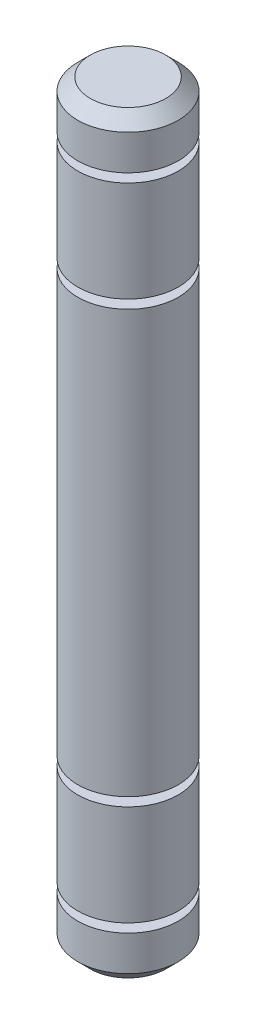
ISO-10303-21;
HEADER;
FILE_DESCRIPTION(('STEP AP214'),'2;1');
FILE_NAME('part.step','',(''),(''),'','','');
FILE_SCHEMA(('AUTOMOTIVE_DESIGN { 1 0 10303 214 1 1 1 1 }'));
ENDSEC;
DATA;
#1=APPLICATION_CONTEXT('core data for automotive mechanical design processes');
#2=APPLICATION_PROTOCOL_DEFINITION('international standard','automotive_design',2000,#1);
#3=PRODUCT_CONTEXT('',#1,'mechanical');
#4=PRODUCT('Part','Part','',(#3));
#5=PRODUCT_RELATED_PRODUCT_CATEGORY('part','',(#4));
#6=PRODUCT_DEFINITION_FORMATION('','',#4);
#7=PRODUCT_DEFINITION_CONTEXT('part definition',#1,'design');
#8=PRODUCT_DEFINITION('design','',#6,#7);
#9=PRODUCT_DEFINITION_SHAPE('','',#8);
#10=(LENGTH_UNIT() NAMED_UNIT(*) SI_UNIT(.MILLI.,.METRE.));
#11=(NAMED_UNIT(*) PLANE_ANGLE_UNIT() SI_UNIT($,.RADIAN.));
#12=(NAMED_UNIT(*) SI_UNIT($,.STERADIAN.) SOLID_ANGLE_UNIT());
#13=UNCERTAINTY_MEASURE_WITH_UNIT(LENGTH_MEASURE(1.E-05),#10,'distance_accuracy_value','');
#14=(GEOMETRIC_REPRESENTATION_CONTEXT(3) GLOBAL_UNCERTAINTY_ASSIGNED_CONTEXT((#13)) GLOBAL_UNIT_ASSIGNED_CONTEXT((#10,
#11,#12)) REPRESENTATION_CONTEXT('',''));
#15=CARTESIAN_POINT('',(0.,0.,0.));
#16=DIRECTION('',(0.,0.,1.));
#17=DIRECTION('',(1.,0.,0.));
#18=AXIS2_PLACEMENT_3D('',#15,#16,#17);
#19=CARTESIAN_POINT('',(4.,0.,0.));
#20=DIRECTION('',(0.,-1.,0.));
#21=DIRECTION('',(1.,0.,0.));
#22=AXIS2_PLACEMENT_3D('',#19,#20,#21);
#23=PLANE('',#22);
#24=CARTESIAN_POINT('',(0.,0.,0.));
#25=DIRECTION('',(0.,-1.,0.));
#26=DIRECTION('',(1.,0.,0.));
#27=AXIS2_PLACEMENT_3D('',#24,#25,#26);
#28=CIRCLE('',#27,2.99999999999998);
#29=CARTESIAN_POINT('',(2.99999999999998,0.,0.));
#30=VERTEX_POINT('',#29);
#31=EDGE_CURVE('E63',#30,#30,#28,.T.);
#32=ORIENTED_EDGE('',*,*,#31,.T.);
#33=EDGE_LOOP('',(#32));
#34=FACE_BOUND('',#33,.T.);
#35=ADVANCED_FACE('F44',(#34),#23,.T.);
#36=CARTESIAN_POINT('',(0.,0.,0.));
#37=DIRECTION('',(0.,-1.,0.));
#38=DIRECTION('',(1.,0.,0.));
#39=AXIS2_PLACEMENT_3D('',#36,#37,#38);
#40=CYLINDRICAL_SURFACE('',#39,4.);
#41=CARTESIAN_POINT('',(0.,1.00000000000002,0.));
#42=DIRECTION('',(0.,-1.,0.));
#43=DIRECTION('',(1.,0.,0.));
#44=AXIS2_PLACEMENT_3D('',#41,#42,#43);
#45=CIRCLE('',#44,4.);
#46=CARTESIAN_POINT('',(4.,1.00000000000002,0.));
#47=VERTEX_POINT('',#46);
#48=EDGE_CURVE('E58',#47,#47,#45,.F.);
#49=ORIENTED_EDGE('',*,*,#48,.T.);
#50=EDGE_LOOP('',(#49));
#51=FACE_BOUND('',#50,.T.);
#52=CARTESIAN_POINT('',(0.,3.8,0.));
#53=DIRECTION('',(0.,-1.,0.));
#54=DIRECTION('',(1.,0.,0.));
#55=AXIS2_PLACEMENT_3D('',#52,#53,#54);
#56=CIRCLE('',#55,4.);
#57=CARTESIAN_POINT('',(4.,3.8,0.));
#58=VERTEX_POINT('',#57);
#59=EDGE_CURVE('E69',#58,#58,#56,.T.);
#60=ORIENTED_EDGE('',*,*,#59,.T.);
#61=EDGE_LOOP('',(#60));
#62=FACE_BOUND('',#61,.T.);
#63=ADVANCED_FACE('F183',(#51,#62),#40,.T.);
#64=CARTESIAN_POINT('',(2.9,3.8,0.));
#65=DIRECTION('',(0.,1.,0.));
#66=DIRECTION('',(-1.,0.,0.));
#67=AXIS2_PLACEMENT_3D('',#64,#65,#66);
#68=PLANE('',#67);
#69=CARTESIAN_POINT('',(0.,3.8,0.));
#70=DIRECTION('',(0.,-1.,0.));
#71=DIRECTION('',(1.,0.,0.));
#72=AXIS2_PLACEMENT_3D('',#69,#70,#71);
#73=CIRCLE('',#72,2.9);
#74=CARTESIAN_POINT('',(2.9,3.8,0.));
#75=VERTEX_POINT('',#74);
#76=EDGE_CURVE('E73',#75,#75,#73,.T.);
#77=ORIENTED_EDGE('',*,*,#76,.T.);
#78=EDGE_LOOP('',(#77));
#79=FACE_BOUND('',#78,.T.);
#80=ORIENTED_EDGE('',*,*,#59,.F.);
#81=EDGE_LOOP('',(#80));
#82=FACE_BOUND('',#81,.T.);
#83=ADVANCED_FACE('F188',(#79,#82),#68,.T.);
#84=CARTESIAN_POINT('',(0.,4.,0.));
#85=DIRECTION('',(0.,-1.,0.));
#86=DIRECTION('',(1.,0.,0.));
#87=AXIS2_PLACEMENT_3D('',#84,#85,#86);
#88=TOROIDAL_SURFACE('',#87,2.9,0.2);
#89=CARTESIAN_POINT('',(0.,4.,0.));
#90=DIRECTION('',(0.,-1.,0.));
#91=DIRECTION('',(1.,0.,0.));
#92=AXIS2_PLACEMENT_3D('',#89,#90,#91);
#93=CIRCLE('',#92,2.7);
#94=CARTESIAN_POINT('',(2.7,4.,0.));
#95=VERTEX_POINT('',#94);
#96=EDGE_CURVE('E77',#95,#95,#93,.T.);
#97=ORIENTED_EDGE('',*,*,#96,.T.);
#98=EDGE_LOOP('',(#97));
#99=FACE_BOUND('',#98,.T.);
#100=ORIENTED_EDGE('',*,*,#76,.F.);
#101=EDGE_LOOP('',(#100));
#102=FACE_BOUND('',#101,.T.);
#103=ADVANCED_FACE('F208',(#99,#102),#88,.F.);
#104=CARTESIAN_POINT('',(0.,0.,0.));
#105=DIRECTION('',(0.,-1.,0.));
#106=DIRECTION('',(1.,0.,0.));
#107=AXIS2_PLACEMENT_3D('',#104,#105,#106);
#108=CYLINDRICAL_SURFACE('',#107,2.7);
#109=CARTESIAN_POINT('',(0.,4.3,0.));
#110=DIRECTION('',(0.,-1.,0.));
#111=DIRECTION('',(1.,0.,0.));
#112=AXIS2_PLACEMENT_3D('',#109,#110,#111);
#113=CIRCLE('',#112,2.7);
#114=CARTESIAN_POINT('',(2.7,4.3,0.));
#115=VERTEX_POINT('',#114);
#116=EDGE_CURVE('E81',#115,#115,#113,.T.);
#117=ORIENTED_EDGE('',*,*,#116,.T.);
#118=EDGE_LOOP('',(#117));
#119=FACE_BOUND('',#118,.T.);
#120=ORIENTED_EDGE('',*,*,#96,.F.);
#121=EDGE_LOOP('',(#120));
#122=FACE_BOUND('',#121,.T.);
#123=ADVANCED_FACE('F213',(#119,#122),#108,.T.);
#124=CARTESIAN_POINT('',(0.,4.3,0.));
#125=DIRECTION('',(0.,-1.,0.));
#126=DIRECTION('',(1.,0.,0.));
#127=AXIS2_PLACEMENT_3D('',#124,#125,#126);
#128=TOROIDAL_SURFACE('',#127,2.9,0.2);
#129=CARTESIAN_POINT('',(0.,4.5,0.));
#130=DIRECTION('',(0.,-1.,0.));
#131=DIRECTION('',(1.,0.,0.));
#132=AXIS2_PLACEMENT_3D('',#129,#130,#131);
#133=CIRCLE('',#132,2.9);
#134=CARTESIAN_POINT('',(2.9,4.5,0.));
#135=VERTEX_POINT('',#134);
#136=EDGE_CURVE('E85',#135,#135,#133,.T.);
#137=ORIENTED_EDGE('',*,*,#136,.T.);
#138=EDGE_LOOP('',(#137));
#139=FACE_BOUND('',#138,.T.);
#140=ORIENTED_EDGE('',*,*,#116,.F.);
#141=EDGE_LOOP('',(#140));
#142=FACE_BOUND('',#141,.T.);
#143=ADVANCED_FACE('F219',(#139,#142),#128,.F.);
#144=CARTESIAN_POINT('',(4.,4.5,0.));
#145=DIRECTION('',(0.,-1.,0.));
#146=DIRECTION('',(1.,0.,0.));
#147=AXIS2_PLACEMENT_3D('',#144,#145,#146);
#148=PLANE('',#147);
#149=CARTESIAN_POINT('',(0.,4.5,0.));
#150=DIRECTION('',(0.,-1.,0.));
#151=DIRECTION('',(1.,0.,0.));
#152=AXIS2_PLACEMENT_3D('',#149,#150,#151);
#153=CIRCLE('',#152,4.);
#154=CARTESIAN_POINT('',(4.,4.5,0.));
#155=VERTEX_POINT('',#154);
#156=EDGE_CURVE('E89',#155,#155,#153,.T.);
#157=ORIENTED_EDGE('',*,*,#156,.T.);
#158=EDGE_LOOP('',(#157));
#159=FACE_BOUND('',#158,.T.);
#160=ORIENTED_EDGE('',*,*,#136,.F.);
#161=EDGE_LOOP('',(#160));
#162=FACE_BOUND('',#161,.T.);
#163=ADVANCED_FACE('F223',(#159,#162),#148,.T.);
#164=CARTESIAN_POINT('',(0.,0.,0.));
#165=DIRECTION('',(0.,-1.,0.));
#166=DIRECTION('',(1.,0.,0.));
#167=AXIS2_PLACEMENT_3D('',#164,#165,#166);
#168=CYLINDRICAL_SURFACE('',#167,4.);
#169=CARTESIAN_POINT('',(0.,12.5,0.));
#170=DIRECTION('',(0.,-1.,0.));
#171=DIRECTION('',(1.,0.,0.));
#172=AXIS2_PLACEMENT_3D('',#169,#170,#171);
#173=CIRCLE('',#172,4.);
#174=CARTESIAN_POINT('',(4.,12.5,0.));
#175=VERTEX_POINT('',#174);
#176=EDGE_CURVE('E93',#175,#175,#173,.T.);
#177=ORIENTED_EDGE('',*,*,#176,.T.);
#178=EDGE_LOOP('',(#177));
#179=FACE_BOUND('',#178,.T.);
#180=ORIENTED_EDGE('',*,*,#156,.F.);
#181=EDGE_LOOP('',(#180));
#182=FACE_BOUND('',#181,.T.);
#183=ADVANCED_FACE('F227',(#179,#182),#168,.T.);
#184=CARTESIAN_POINT('',(2.9,12.5,0.));
#185=DIRECTION('',(0.,1.,0.));
#186=DIRECTION('',(-1.,0.,0.));
#187=AXIS2_PLACEMENT_3D('',#184,#185,#186);
#188=PLANE('',#187);
#189=CARTESIAN_POINT('',(0.,12.5,0.));
#190=DIRECTION('',(0.,-1.,0.));
#191=DIRECTION('',(1.,0.,0.));
#192=AXIS2_PLACEMENT_3D('',#189,#190,#191);
#193=CIRCLE('',#192,2.9);
#194=CARTESIAN_POINT('',(2.9,12.5,0.));
#195=VERTEX_POINT('',#194);
#196=EDGE_CURVE('E97',#195,#195,#193,.T.);
#197=ORIENTED_EDGE('',*,*,#196,.T.);
#198=EDGE_LOOP('',(#197));
#199=FACE_BOUND('',#198,.T.);
#200=ORIENTED_EDGE('',*,*,#176,.F.);
#201=EDGE_LOOP('',(#200));
#202=FACE_BOUND('',#201,.T.);
#203=ADVANCED_FACE('F231',(#199,#202),#188,.T.);
#204=CARTESIAN_POINT('',(0.,12.7,0.));
#205=DIRECTION('',(0.,-1.,0.));
#206=DIRECTION('',(1.,0.,0.));
#207=AXIS2_PLACEMENT_3D('',#204,#205,#206);
#208=TOROIDAL_SURFACE('',#207,2.9,0.2);
#209=CARTESIAN_POINT('',(0.,12.7,0.));
#210=DIRECTION('',(0.,-1.,0.));
#211=DIRECTION('',(1.,0.,0.));
#212=AXIS2_PLACEMENT_3D('',#209,#210,#211);
#213=CIRCLE('',#212,2.7);
#214=CARTESIAN_POINT('',(2.7,12.7,0.));
#215=VERTEX_POINT('',#214);
#216=EDGE_CURVE('E101',#215,#215,#213,.T.);
#217=ORIENTED_EDGE('',*,*,#216,.T.);
#218=EDGE_LOOP('',(#217));
#219=FACE_BOUND('',#218,.T.);
#220=ORIENTED_EDGE('',*,*,#196,.F.);
#221=EDGE_LOOP('',(#220));
#222=FACE_BOUND('',#221,.T.);
#223=ADVANCED_FACE('F235',(#219,#222),#208,.F.);
#224=CARTESIAN_POINT('',(0.,0.,0.));
#225=DIRECTION('',(0.,-1.,0.));
#226=DIRECTION('',(1.,0.,0.));
#227=AXIS2_PLACEMENT_3D('',#224,#225,#226);
#228=CYLINDRICAL_SURFACE('',#227,2.7);
#229=CARTESIAN_POINT('',(0.,13.,0.));
#230=DIRECTION('',(0.,-1.,0.));
#231=DIRECTION('',(1.,0.,0.));
#232=AXIS2_PLACEMENT_3D('',#229,#230,#231);
#233=CIRCLE('',#232,2.7);
#234=CARTESIAN_POINT('',(2.7,13.,0.));
#235=VERTEX_POINT('',#234);
#236=EDGE_CURVE('E105',#235,#235,#233,.T.);
#237=ORIENTED_EDGE('',*,*,#236,.T.);
#238=EDGE_LOOP('',(#237));
#239=FACE_BOUND('',#238,.T.);
#240=ORIENTED_EDGE('',*,*,#216,.F.);
#241=EDGE_LOOP('',(#240));
#242=FACE_BOUND('',#241,.T.);
#243=ADVANCED_FACE('F239',(#239,#242),#228,.T.);
#244=CARTESIAN_POINT('',(0.,13.,0.));
#245=DIRECTION('',(0.,-1.,0.));
#246=DIRECTION('',(1.,0.,0.));
#247=AXIS2_PLACEMENT_3D('',#244,#245,#246);
#248=TOROIDAL_SURFACE('',#247,2.9,0.2);
#249=CARTESIAN_POINT('',(0.,13.2,0.));
#250=DIRECTION('',(0.,-1.,0.));
#251=DIRECTION('',(1.,0.,0.));
#252=AXIS2_PLACEMENT_3D('',#249,#250,#251);
#253=CIRCLE('',#252,2.9);
#254=CARTESIAN_POINT('',(2.9,13.2,0.));
#255=VERTEX_POINT('',#254);
#256=EDGE_CURVE('E109',#255,#255,#253,.T.);
#257=ORIENTED_EDGE('',*,*,#256,.T.);
#258=EDGE_LOOP('',(#257));
#259=FACE_BOUND('',#258,.T.);
#260=ORIENTED_EDGE('',*,*,#236,.F.);
#261=EDGE_LOOP('',(#260));
#262=FACE_BOUND('',#261,.T.);
#263=ADVANCED_FACE('F243',(#259,#262),#248,.F.);
#264=CARTESIAN_POINT('',(4.,13.2,0.));
#265=DIRECTION('',(0.,-1.,0.));
#266=DIRECTION('',(1.,0.,0.));
#267=AXIS2_PLACEMENT_3D('',#264,#265,#266);
#268=PLANE('',#267);
#269=CARTESIAN_POINT('',(0.,13.2,0.));
#270=DIRECTION('',(0.,-1.,0.));
#271=DIRECTION('',(1.,0.,0.));
#272=AXIS2_PLACEMENT_3D('',#269,#270,#271);
#273=CIRCLE('',#272,4.);
#274=CARTESIAN_POINT('',(4.,13.2,0.));
#275=VERTEX_POINT('',#274);
#276=EDGE_CURVE('E113',#275,#275,#273,.T.);
#277=ORIENTED_EDGE('',*,*,#276,.T.);
#278=EDGE_LOOP('',(#277));
#279=FACE_BOUND('',#278,.T.);
#280=ORIENTED_EDGE('',*,*,#256,.F.);
#281=EDGE_LOOP('',(#280));
#282=FACE_BOUND('',#281,.T.);
#283=ADVANCED_FACE('F247',(#279,#282),#268,.T.);
#284=CARTESIAN_POINT('',(0.,0.,0.));
#285=DIRECTION('',(0.,-1.,0.));
#286=DIRECTION('',(1.,0.,0.));
#287=AXIS2_PLACEMENT_3D('',#284,#285,#286);
#288=CYLINDRICAL_SURFACE('',#287,4.);
#289=CARTESIAN_POINT('',(0.,46.8,0.));
#290=DIRECTION('',(0.,-1.,0.));
#291=DIRECTION('',(1.,0.,0.));
#292=AXIS2_PLACEMENT_3D('',#289,#290,#291);
#293=CIRCLE('',#292,4.);
#294=CARTESIAN_POINT('',(4.,46.8,0.));
#295=VERTEX_POINT('',#294);
#296=EDGE_CURVE('E117',#295,#295,#293,.T.);
#297=ORIENTED_EDGE('',*,*,#296,.T.);
#298=EDGE_LOOP('',(#297));
#299=FACE_BOUND('',#298,.T.);
#300=ORIENTED_EDGE('',*,*,#276,.F.);
#301=EDGE_LOOP('',(#300));
#302=FACE_BOUND('',#301,.T.);
#303=ADVANCED_FACE('F251',(#299,#302),#288,.T.);
#304=CARTESIAN_POINT('',(4.,46.8,0.));
#305=DIRECTION('',(0.,1.,0.));
#306=DIRECTION('',(-1.,0.,0.));
#307=AXIS2_PLACEMENT_3D('',#304,#305,#306);
#308=PLANE('',#307);
#309=CARTESIAN_POINT('',(0.,46.8,0.));
#310=DIRECTION('',(0.,-1.,0.));
#311=DIRECTION('',(1.,0.,0.));
#312=AXIS2_PLACEMENT_3D('',#309,#310,#311);
#313=CIRCLE('',#312,2.9);
#314=CARTESIAN_POINT('',(2.9,46.8,0.));
#315=VERTEX_POINT('',#314);
#316=EDGE_CURVE('E121',#315,#315,#313,.T.);
#317=ORIENTED_EDGE('',*,*,#316,.T.);
#318=EDGE_LOOP('',(#317));
#319=FACE_BOUND('',#318,.T.);
#320=ORIENTED_EDGE('',*,*,#296,.F.);
#321=EDGE_LOOP('',(#320));
#322=FACE_BOUND('',#321,.T.);
#323=ADVANCED_FACE('F255',(#319,#322),#308,.T.);
#324=CARTESIAN_POINT('',(0.,47.,0.));
#325=DIRECTION('',(0.,-1.,0.));
#326=DIRECTION('',(1.,0.,0.));
#327=AXIS2_PLACEMENT_3D('',#324,#325,#326);
#328=TOROIDAL_SURFACE('',#327,2.9,0.199999999999999);
#329=CARTESIAN_POINT('',(0.,47.,0.));
#330=DIRECTION('',(0.,-1.,0.));
#331=DIRECTION('',(1.,0.,0.));
#332=AXIS2_PLACEMENT_3D('',#329,#330,#331);
#333=CIRCLE('',#332,2.7);
#334=CARTESIAN_POINT('',(2.7,47.,0.));
#335=VERTEX_POINT('',#334);
#336=EDGE_CURVE('E125',#335,#335,#333,.T.);
#337=ORIENTED_EDGE('',*,*,#336,.T.);
#338=EDGE_LOOP('',(#337));
#339=FACE_BOUND('',#338,.T.);
#340=ORIENTED_EDGE('',*,*,#316,.F.);
#341=EDGE_LOOP('',(#340));
#342=FACE_BOUND('',#341,.T.);
#343=ADVANCED_FACE('F259',(#339,#342),#328,.F.);
#344=CARTESIAN_POINT('',(0.,0.,0.));
#345=DIRECTION('',(0.,-1.,0.));
#346=DIRECTION('',(1.,0.,0.));
#347=AXIS2_PLACEMENT_3D('',#344,#345,#346);
#348=CYLINDRICAL_SURFACE('',#347,2.7);
#349=CARTESIAN_POINT('',(0.,47.3,0.));
#350=DIRECTION('',(0.,-1.,0.));
#351=DIRECTION('',(1.,0.,0.));
#352=AXIS2_PLACEMENT_3D('',#349,#350,#351);
#353=CIRCLE('',#352,2.7);
#354=CARTESIAN_POINT('',(2.7,47.3,0.));
#355=VERTEX_POINT('',#354);
#356=EDGE_CURVE('E129',#355,#355,#353,.T.);
#357=ORIENTED_EDGE('',*,*,#356,.T.);
#358=EDGE_LOOP('',(#357));
#359=FACE_BOUND('',#358,.T.);
#360=ORIENTED_EDGE('',*,*,#336,.F.);
#361=EDGE_LOOP('',(#360));
#362=FACE_BOUND('',#361,.T.);
#363=ADVANCED_FACE('F263',(#359,#362),#348,.T.);
#364=CARTESIAN_POINT('',(0.,47.3,0.));
#365=DIRECTION('',(0.,-1.,0.));
#366=DIRECTION('',(1.,0.,0.));
#367=AXIS2_PLACEMENT_3D('',#364,#365,#366);
#368=TOROIDAL_SURFACE('',#367,2.9,0.199999999999999);
#369=CARTESIAN_POINT('',(0.,47.5,0.));
#370=DIRECTION('',(0.,-1.,0.));
#371=DIRECTION('',(1.,0.,0.));
#372=AXIS2_PLACEMENT_3D('',#369,#370,#371);
#373=CIRCLE('',#372,2.9);
#374=CARTESIAN_POINT('',(2.9,47.5,0.));
#375=VERTEX_POINT('',#374);
#376=EDGE_CURVE('E133',#375,#375,#373,.T.);
#377=ORIENTED_EDGE('',*,*,#376,.T.);
#378=EDGE_LOOP('',(#377));
#379=FACE_BOUND('',#378,.T.);
#380=ORIENTED_EDGE('',*,*,#356,.F.);
#381=EDGE_LOOP('',(#380));
#382=FACE_BOUND('',#381,.T.);
#383=ADVANCED_FACE('F267',(#379,#382),#368,.F.);
#384=CARTESIAN_POINT('',(2.9,47.5,0.));
#385=DIRECTION('',(0.,-1.,0.));
#386=DIRECTION('',(1.,0.,0.));
#387=AXIS2_PLACEMENT_3D('',#384,#385,#386);
#388=PLANE('',#387);
#389=CARTESIAN_POINT('',(0.,47.5,0.));
#390=DIRECTION('',(0.,-1.,0.));
#391=DIRECTION('',(1.,0.,0.));
#392=AXIS2_PLACEMENT_3D('',#389,#390,#391);
#393=CIRCLE('',#392,4.);
#394=CARTESIAN_POINT('',(4.,47.5,0.));
#395=VERTEX_POINT('',#394);
#396=EDGE_CURVE('E137',#395,#395,#393,.T.);
#397=ORIENTED_EDGE('',*,*,#396,.T.);
#398=EDGE_LOOP('',(#397));
#399=FACE_BOUND('',#398,.T.);
#400=ORIENTED_EDGE('',*,*,#376,.F.);
#401=EDGE_LOOP('',(#400));
#402=FACE_BOUND('',#401,.T.);
#403=ADVANCED_FACE('F271',(#399,#402),#388,.T.);
#404=CARTESIAN_POINT('',(0.,0.,0.));
#405=DIRECTION('',(0.,-1.,0.));
#406=DIRECTION('',(1.,0.,0.));
#407=AXIS2_PLACEMENT_3D('',#404,#405,#406);
#408=CYLINDRICAL_SURFACE('',#407,4.);
#409=CARTESIAN_POINT('',(0.,55.5,0.));
#410=DIRECTION('',(0.,-1.,0.));
#411=DIRECTION('',(1.,0.,0.));
#412=AXIS2_PLACEMENT_3D('',#409,#410,#411);
#413=CIRCLE('',#412,4.);
#414=CARTESIAN_POINT('',(4.,55.5,0.));
#415=VERTEX_POINT('',#414);
#416=EDGE_CURVE('E141',#415,#415,#413,.T.);
#417=ORIENTED_EDGE('',*,*,#416,.T.);
#418=EDGE_LOOP('',(#417));
#419=FACE_BOUND('',#418,.T.);
#420=ORIENTED_EDGE('',*,*,#396,.F.);
#421=EDGE_LOOP('',(#420));
#422=FACE_BOUND('',#421,.T.);
#423=ADVANCED_FACE('F275',(#419,#422),#408,.T.);
#424=CARTESIAN_POINT('',(4.,55.5,0.));
#425=DIRECTION('',(0.,1.,0.));
#426=DIRECTION('',(-1.,0.,0.));
#427=AXIS2_PLACEMENT_3D('',#424,#425,#426);
#428=PLANE('',#427);
#429=CARTESIAN_POINT('',(0.,55.5,0.));
#430=DIRECTION('',(0.,-1.,0.));
#431=DIRECTION('',(1.,0.,0.));
#432=AXIS2_PLACEMENT_3D('',#429,#430,#431);
#433=CIRCLE('',#432,2.9);
#434=CARTESIAN_POINT('',(2.9,55.5,0.));
#435=VERTEX_POINT('',#434);
#436=EDGE_CURVE('E145',#435,#435,#433,.T.);
#437=ORIENTED_EDGE('',*,*,#436,.T.);
#438=EDGE_LOOP('',(#437));
#439=FACE_BOUND('',#438,.T.);
#440=ORIENTED_EDGE('',*,*,#416,.F.);
#441=EDGE_LOOP('',(#440));
#442=FACE_BOUND('',#441,.T.);
#443=ADVANCED_FACE('F279',(#439,#442),#428,.T.);
#444=CARTESIAN_POINT('',(0.,55.7,0.));
#445=DIRECTION('',(0.,-1.,0.));
#446=DIRECTION('',(1.,0.,0.));
#447=AXIS2_PLACEMENT_3D('',#444,#445,#446);
#448=TOROIDAL_SURFACE('',#447,2.9,0.199999999999999);
#449=CARTESIAN_POINT('',(0.,55.7,0.));
#450=DIRECTION('',(0.,-1.,0.));
#451=DIRECTION('',(1.,0.,0.));
#452=AXIS2_PLACEMENT_3D('',#449,#450,#451);
#453=CIRCLE('',#452,2.7);
#454=CARTESIAN_POINT('',(2.7,55.7,0.));
#455=VERTEX_POINT('',#454);
#456=EDGE_CURVE('E149',#455,#455,#453,.T.);
#457=ORIENTED_EDGE('',*,*,#456,.T.);
#458=EDGE_LOOP('',(#457));
#459=FACE_BOUND('',#458,.T.);
#460=ORIENTED_EDGE('',*,*,#436,.F.);
#461=EDGE_LOOP('',(#460));
#462=FACE_BOUND('',#461,.T.);
#463=ADVANCED_FACE('F283',(#459,#462),#448,.F.);
#464=CARTESIAN_POINT('',(0.,0.,0.));
#465=DIRECTION('',(0.,-1.,0.));
#466=DIRECTION('',(1.,0.,0.));
#467=AXIS2_PLACEMENT_3D('',#464,#465,#466);
#468=CYLINDRICAL_SURFACE('',#467,2.7);
#469=CARTESIAN_POINT('',(0.,56.,0.));
#470=DIRECTION('',(0.,-1.,0.));
#471=DIRECTION('',(1.,0.,0.));
#472=AXIS2_PLACEMENT_3D('',#469,#470,#471);
#473=CIRCLE('',#472,2.7);
#474=CARTESIAN_POINT('',(2.7,56.,0.));
#475=VERTEX_POINT('',#474);
#476=EDGE_CURVE('E153',#475,#475,#473,.T.);
#477=ORIENTED_EDGE('',*,*,#476,.T.);
#478=EDGE_LOOP('',(#477));
#479=FACE_BOUND('',#478,.T.);
#480=ORIENTED_EDGE('',*,*,#456,.F.);
#481=EDGE_LOOP('',(#480));
#482=FACE_BOUND('',#481,.T.);
#483=ADVANCED_FACE('F287',(#479,#482),#468,.T.);
#484=CARTESIAN_POINT('',(0.,56.,0.));
#485=DIRECTION('',(0.,-1.,0.));
#486=DIRECTION('',(1.,0.,0.));
#487=AXIS2_PLACEMENT_3D('',#484,#485,#486);
#488=TOROIDAL_SURFACE('',#487,2.9,0.199999999999999);
#489=CARTESIAN_POINT('',(0.,56.2,0.));
#490=DIRECTION('',(0.,-1.,0.));
#491=DIRECTION('',(1.,0.,0.));
#492=AXIS2_PLACEMENT_3D('',#489,#490,#491);
#493=CIRCLE('',#492,2.9);
#494=CARTESIAN_POINT('',(2.9,56.2,0.));
#495=VERTEX_POINT('',#494);
#496=EDGE_CURVE('E157',#495,#495,#493,.T.);
#497=ORIENTED_EDGE('',*,*,#496,.T.);
#498=EDGE_LOOP('',(#497));
#499=FACE_BOUND('',#498,.T.);
#500=ORIENTED_EDGE('',*,*,#476,.F.);
#501=EDGE_LOOP('',(#500));
#502=FACE_BOUND('',#501,.T.);
#503=ADVANCED_FACE('F180',(#499,#502),#488,.F.);
#504=CARTESIAN_POINT('',(2.9,56.2,0.));
#505=DIRECTION('',(0.,-1.,0.));
#506=DIRECTION('',(1.,0.,0.));
#507=AXIS2_PLACEMENT_3D('',#504,#505,#506);
#508=PLANE('',#507);
#509=CARTESIAN_POINT('',(0.,56.2,0.));
#510=DIRECTION('',(0.,-1.,0.));
#511=DIRECTION('',(1.,0.,0.));
#512=AXIS2_PLACEMENT_3D('',#509,#510,#511);
#513=CIRCLE('',#512,4.);
#514=CARTESIAN_POINT('',(4.,56.2,0.));
#515=VERTEX_POINT('',#514);
#516=EDGE_CURVE('E161',#515,#515,#513,.T.);
#517=ORIENTED_EDGE('',*,*,#516,.T.);
#518=EDGE_LOOP('',(#517));
#519=FACE_BOUND('',#518,.T.);
#520=ORIENTED_EDGE('',*,*,#496,.F.);
#521=EDGE_LOOP('',(#520));
#522=FACE_BOUND('',#521,.T.);
#523=ADVANCED_FACE('F166',(#519,#522),#508,.T.);
#524=CARTESIAN_POINT('',(0.,0.,0.));
#525=DIRECTION('',(0.,-1.,0.));
#526=DIRECTION('',(1.,0.,0.));
#527=AXIS2_PLACEMENT_3D('',#524,#525,#526);
#528=CYLINDRICAL_SURFACE('',#527,4.);
#529=CARTESIAN_POINT('',(0.,59.,0.));
#530=DIRECTION('',(0.,1.,0.));
#531=DIRECTION('',(-1.,0.,0.));
#532=AXIS2_PLACEMENT_3D('',#529,#530,#531);
#533=CIRCLE('',#532,4.);
#534=CARTESIAN_POINT('',(-4.,59.,0.));
#535=VERTEX_POINT('',#534);
#536=EDGE_CURVE('E53',#535,#535,#533,.F.);
#537=ORIENTED_EDGE('',*,*,#536,.T.);
#538=EDGE_LOOP('',(#537));
#539=FACE_BOUND('',#538,.T.);
#540=ORIENTED_EDGE('',*,*,#516,.F.);
#541=EDGE_LOOP('',(#540));
#542=FACE_BOUND('',#541,.T.);
#543=ADVANCED_FACE('F169',(#539,#542),#528,.T.);
#544=CARTESIAN_POINT('',(0.,60.,0.));
#545=DIRECTION('',(0.,1.,0.));
#546=DIRECTION('',(-1.,0.,0.));
#547=AXIS2_PLACEMENT_3D('',#544,#545,#546);
#548=PLANE('',#547);
#549=CARTESIAN_POINT('',(0.,60.,0.));
#550=DIRECTION('',(0.,1.,0.));
#551=DIRECTION('',(-1.,0.,0.));
#552=AXIS2_PLACEMENT_3D('',#549,#550,#551);
#553=CIRCLE('',#552,3.00000000000001);
#554=CARTESIAN_POINT('',(-3.00000000000001,60.,0.));
#555=VERTEX_POINT('',#554);
#556=EDGE_CURVE('E10',#555,#555,#553,.T.);
#557=ORIENTED_EDGE('',*,*,#556,.T.);
#558=EDGE_LOOP('',(#557));
#559=FACE_BOUND('',#558,.T.);
#560=ADVANCED_FACE('F171',(#559),#548,.T.);
#561=CARTESIAN_POINT('',(0.,0.,0.));
#562=DIRECTION('',(0.,1.,0.));
#563=DIRECTION('',(-1.,0.,0.));
#564=AXIS2_PLACEMENT_3D('',#561,#562,#563);
#565=CONICAL_SURFACE('',#564,2.99999999999998,0.785398163397448);
#566=ORIENTED_EDGE('',*,*,#48,.F.);
#567=EDGE_LOOP('',(#566));
#568=FACE_BOUND('',#567,.T.);
#569=ORIENTED_EDGE('',*,*,#31,.F.);
#570=EDGE_LOOP('',(#569));
#571=FACE_BOUND('',#570,.T.);
#572=ADVANCED_FACE('F177',(#568,#571),#565,.T.);
#573=CARTESIAN_POINT('',(0.,59.,0.));
#574=DIRECTION('',(0.,-1.,0.));
#575=DIRECTION('',(1.,0.,0.));
#576=AXIS2_PLACEMENT_3D('',#573,#574,#575);
#577=CONICAL_SURFACE('',#576,4.,0.785398163397457);
#578=ORIENTED_EDGE('',*,*,#556,.F.);
#579=EDGE_LOOP('',(#578));
#580=FACE_BOUND('',#579,.T.);
#581=ORIENTED_EDGE('',*,*,#536,.F.);
#582=EDGE_LOOP('',(#581));
#583=FACE_BOUND('',#582,.T.);
#584=ADVANCED_FACE('F47',(#580,#583),#577,.T.);
#585=CLOSED_SHELL('',(#35,#63,#83,#103,#123,#143,#163,#183,#203,#223,#243,#263,#283,#303,#323,
#343,#363,#383,#403,#423,#443,#463,#483,#503,#523,#543,#560,#572,#584));
#586=MANIFOLD_SOLID_BREP('B2',#585);
#587=ADVANCED_BREP_SHAPE_REPRESENTATION('',(#18,#586),#14);
#588=SHAPE_DEFINITION_REPRESENTATION(#9,#587);
ENDSEC;
END-ISO-10303-21;
